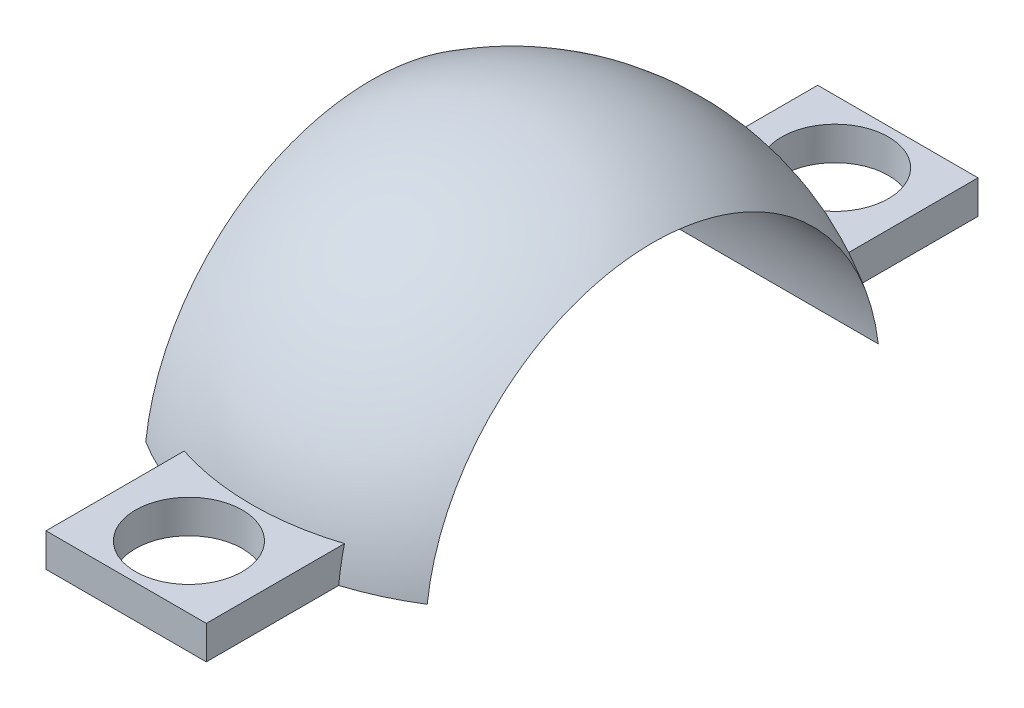
ISO-10303-21;
HEADER;
FILE_DESCRIPTION(('STEP AP214'),'2;1');
FILE_NAME('part.step','',(''),(''),'','','');
FILE_SCHEMA(('AUTOMOTIVE_DESIGN { 1 0 10303 214 1 1 1 1 }'));
ENDSEC;
DATA;
#1=APPLICATION_CONTEXT('core data for automotive mechanical design processes');
#2=APPLICATION_PROTOCOL_DEFINITION('international standard','automotive_design',2000,#1);
#3=PRODUCT_CONTEXT('',#1,'mechanical');
#4=PRODUCT('Part','Part','',(#3));
#5=PRODUCT_RELATED_PRODUCT_CATEGORY('part','',(#4));
#6=PRODUCT_DEFINITION_FORMATION('','',#4);
#7=PRODUCT_DEFINITION_CONTEXT('part definition',#1,'design');
#8=PRODUCT_DEFINITION('design','',#6,#7);
#9=PRODUCT_DEFINITION_SHAPE('','',#8);
#10=(LENGTH_UNIT() NAMED_UNIT(*) SI_UNIT(.MILLI.,.METRE.));
#11=(NAMED_UNIT(*) PLANE_ANGLE_UNIT() SI_UNIT($,.RADIAN.));
#12=(NAMED_UNIT(*) SI_UNIT($,.STERADIAN.) SOLID_ANGLE_UNIT());
#13=UNCERTAINTY_MEASURE_WITH_UNIT(LENGTH_MEASURE(1.E-05),#10,'distance_accuracy_value','');
#14=(GEOMETRIC_REPRESENTATION_CONTEXT(3) GLOBAL_UNCERTAINTY_ASSIGNED_CONTEXT((#13)) GLOBAL_UNIT_ASSIGNED_CONTEXT((#10,
#11,#12)) REPRESENTATION_CONTEXT('',''));
#15=CARTESIAN_POINT('',(0.,0.,0.));
#16=DIRECTION('',(0.,0.,1.));
#17=DIRECTION('',(1.,0.,0.));
#18=AXIS2_PLACEMENT_3D('',#15,#16,#17);
#19=CARTESIAN_POINT('',(60.,-5.00000000000006,0.));
#20=DIRECTION('',(-1.,0.,0.));
#21=DIRECTION('',(0.,0.,1.));
#22=AXIS2_PLACEMENT_3D('',#19,#20,#21);
#23=CYLINDRICAL_SURFACE('',#22,8.5);
#24=CARTESIAN_POINT('',(5.26782687642637,-5.00000000000006,0.));
#25=DIRECTION('',(-1.,0.,0.));
#26=DIRECTION('',(0.,0.,1.));
#27=AXIS2_PLACEMENT_3D('',#24,#25,#26);
#28=CIRCLE('',#27,8.5);
#29=CARTESIAN_POINT('',(5.26782687642637,-4.00000000000006,-8.44097150806707));
#30=VERTEX_POINT('',#29);
#31=CARTESIAN_POINT('',(5.26782687642637,-4.00000000000006,8.44097150806707));
#32=VERTEX_POINT('',#31);
#33=EDGE_CURVE('E206',#30,#32,#28,.F.);
#34=ORIENTED_EDGE('',*,*,#33,.T.);
#35=DIRECTION('',(-1.,0.,0.));
#36=VECTOR('',#35,1.);
#37=CARTESIAN_POINT('',(60.,-4.00000000000006,8.44097150806707));
#38=LINE('',#37,#36);
#39=CARTESIAN_POINT('',(-5.26782687642637,-4.00000000000006,8.44097150806707));
#40=VERTEX_POINT('',#39);
#41=EDGE_CURVE('E217',#32,#40,#38,.T.);
#42=ORIENTED_EDGE('',*,*,#41,.T.);
#43=CARTESIAN_POINT('',(-5.26782687642637,-5.00000000000006,0.));
#44=DIRECTION('',(1.,0.,0.));
#45=DIRECTION('',(0.,0.,-1.));
#46=AXIS2_PLACEMENT_3D('',#43,#44,#45);
#47=CIRCLE('',#46,8.5);
#48=CARTESIAN_POINT('',(-5.26782687642637,-4.00000000000006,-8.44097150806707));
#49=VERTEX_POINT('',#48);
#50=EDGE_CURVE('E210',#40,#49,#47,.F.);
#51=ORIENTED_EDGE('',*,*,#50,.T.);
#52=DIRECTION('',(-1.,0.,0.));
#53=VECTOR('',#52,1.);
#54=CARTESIAN_POINT('',(60.,-4.00000000000006,-8.44097150806707));
#55=LINE('',#54,#53);
#56=EDGE_CURVE('E214',#49,#30,#55,.F.);
#57=ORIENTED_EDGE('',*,*,#56,.T.);
#58=EDGE_LOOP('',(#34,#42,#51,#57));
#59=FACE_BOUND('',#58,.T.);
#60=ADVANCED_FACE('F47',(#59),#23,.F.);
#61=CARTESIAN_POINT('',(0.,-5.00000000000006,0.));
#62=DIRECTION('',(0.,-1.,0.));
#63=DIRECTION('',(0.,0.,1.));
#64=AXIS2_PLACEMENT_3D('',#61,#62,#63);
#65=SPHERICAL_SURFACE('',#64,10.);
#66=CARTESIAN_POINT('',(0.,-2.75000000000006,0.));
#67=DIRECTION('',(0.,-1.,0.));
#68=DIRECTION('',(0.,0.,-1.));
#69=AXIS2_PLACEMENT_3D('',#66,#67,#68);
#70=CIRCLE('',#69,9.74358763495254);
#71=CARTESIAN_POINT('',(-3.,-2.75000000000006,-9.27024810886958));
#72=VERTEX_POINT('',#71);
#73=CARTESIAN_POINT('',(3.,-2.75000000000006,-9.27024810886958));
#74=VERTEX_POINT('',#73);
#75=EDGE_CURVE('E12',#72,#74,#70,.T.);
#76=ORIENTED_EDGE('',*,*,#75,.F.);
#77=CARTESIAN_POINT('',(-3.,-5.00000000000006,0.));
#78=DIRECTION('',(-1.,0.,0.));
#79=DIRECTION('',(0.,0.,1.));
#80=AXIS2_PLACEMENT_3D('',#77,#78,#79);
#81=CIRCLE('',#80,9.53939201416946);
#82=CARTESIAN_POINT('',(-3.,-4.00000000000006,-9.48683298050514));
#83=VERTEX_POINT('',#82);
#84=EDGE_CURVE('E163',#72,#83,#81,.T.);
#85=ORIENTED_EDGE('',*,*,#84,.T.);
#86=CARTESIAN_POINT('',(0.,-4.00000000000006,0.));
#87=DIRECTION('',(0.,-1.,0.));
#88=DIRECTION('',(0.,0.,-1.));
#89=AXIS2_PLACEMENT_3D('',#86,#87,#88);
#90=CIRCLE('',#89,9.9498743710662);
#91=EDGE_CURVE('E129',#49,#83,#90,.T.);
#92=ORIENTED_EDGE('',*,*,#91,.F.);
#93=ORIENTED_EDGE('',*,*,#50,.F.);
#94=CARTESIAN_POINT('',(-3.,-4.00000000000006,9.48683298050514));
#95=VERTEX_POINT('',#94);
#96=EDGE_CURVE('E204',#95,#40,#90,.T.);
#97=ORIENTED_EDGE('',*,*,#96,.F.);
#98=CARTESIAN_POINT('',(-3.,-5.00000000000006,0.));
#99=DIRECTION('',(-1.,0.,0.));
#100=DIRECTION('',(0.,0.,1.));
#101=AXIS2_PLACEMENT_3D('',#98,#99,#100);
#102=CIRCLE('',#101,9.53939201416946);
#103=CARTESIAN_POINT('',(-3.,-2.75000000000006,9.27024810886958));
#104=VERTEX_POINT('',#103);
#105=EDGE_CURVE('E198',#95,#104,#102,.T.);
#106=ORIENTED_EDGE('',*,*,#105,.T.);
#107=CARTESIAN_POINT('',(0.,-2.75000000000006,0.));
#108=DIRECTION('',(0.,1.,0.));
#109=DIRECTION('',(0.,0.,1.));
#110=AXIS2_PLACEMENT_3D('',#107,#108,#109);
#111=CIRCLE('',#110,9.74358763495254);
#112=CARTESIAN_POINT('',(3.,-2.75000000000006,9.27024810886958));
#113=VERTEX_POINT('',#112);
#114=EDGE_CURVE('E56',#104,#113,#111,.T.);
#115=ORIENTED_EDGE('',*,*,#114,.T.);
#116=CARTESIAN_POINT('',(3.,-5.00000000000006,0.));
#117=DIRECTION('',(-1.,0.,0.));
#118=DIRECTION('',(0.,0.,1.));
#119=AXIS2_PLACEMENT_3D('',#116,#117,#118);
#120=CIRCLE('',#119,9.53939201416946);
#121=CARTESIAN_POINT('',(3.,-4.00000000000006,9.48683298050514));
#122=VERTEX_POINT('',#121);
#123=EDGE_CURVE('E191',#122,#113,#120,.T.);
#124=ORIENTED_EDGE('',*,*,#123,.F.);
#125=EDGE_CURVE('E205',#32,#122,#90,.T.);
#126=ORIENTED_EDGE('',*,*,#125,.F.);
#127=ORIENTED_EDGE('',*,*,#33,.F.);
#128=CARTESIAN_POINT('',(3.,-4.00000000000006,-9.48683298050514));
#129=VERTEX_POINT('',#128);
#130=EDGE_CURVE('E201',#129,#30,#90,.T.);
#131=ORIENTED_EDGE('',*,*,#130,.F.);
#132=CARTESIAN_POINT('',(3.,-5.00000000000006,0.));
#133=DIRECTION('',(-1.,0.,0.));
#134=DIRECTION('',(0.,0.,1.));
#135=AXIS2_PLACEMENT_3D('',#132,#133,#134);
#136=CIRCLE('',#135,9.53939201416946);
#137=EDGE_CURVE('E66',#74,#129,#136,.T.);
#138=ORIENTED_EDGE('',*,*,#137,.F.);
#139=EDGE_LOOP('',(#76,#85,#92,#93,#97,#106,#115,#124,#126,#127,#131,#138));
#140=FACE_BOUND('',#139,.T.);
#141=ADVANCED_FACE('F49',(#140),#65,.T.);
#142=CARTESIAN_POINT('',(60.,-4.00000000000006,11.3331012878524));
#143=DIRECTION('',(0.,-1.,0.));
#144=DIRECTION('',(0.,0.,-1.));
#145=AXIS2_PLACEMENT_3D('',#142,#143,#144);
#146=PLANE('',#145);
#147=CARTESIAN_POINT('',(0.,-4.00000000000006,-12.0922795715098));
#148=DIRECTION('',(0.,-1.,0.));
#149=DIRECTION('',(0.,0.,-1.));
#150=AXIS2_PLACEMENT_3D('',#147,#148,#149);
#151=CIRCLE('',#150,2.);
#152=CARTESIAN_POINT('',(0.,-4.00000000000006,-14.0922795715098));
#153=VERTEX_POINT('',#152);
#154=EDGE_CURVE('E256',#153,#153,#151,.T.);
#155=ORIENTED_EDGE('',*,*,#154,.F.);
#156=EDGE_LOOP('',(#155));
#157=FACE_BOUND('',#156,.T.);
#158=ORIENTED_EDGE('',*,*,#91,.T.);
#159=DIRECTION('',(0.,0.,-1.));
#160=VECTOR('',#159,1.);
#161=CARTESIAN_POINT('',(-3.,-4.00000000000006,-8.44097150806707));
#162=LINE('',#161,#160);
#163=CARTESIAN_POINT('',(-3.,-4.00000000000006,-14.4409715080671));
#164=VERTEX_POINT('',#163);
#165=EDGE_CURVE('E122',#83,#164,#162,.T.);
#166=ORIENTED_EDGE('',*,*,#165,.T.);
#167=DIRECTION('',(1.,0.,0.));
#168=VECTOR('',#167,1.);
#169=CARTESIAN_POINT('',(-3.,-4.00000000000006,-14.4409715080671));
#170=LINE('',#169,#168);
#171=CARTESIAN_POINT('',(3.,-4.00000000000006,-14.4409715080671));
#172=VERTEX_POINT('',#171);
#173=EDGE_CURVE('E126',#164,#172,#170,.T.);
#174=ORIENTED_EDGE('',*,*,#173,.T.);
#175=DIRECTION('',(0.,0.,-1.));
#176=VECTOR('',#175,1.);
#177=CARTESIAN_POINT('',(3.,-4.00000000000006,-8.44097150806707));
#178=LINE('',#177,#176);
#179=EDGE_CURVE('E151',#129,#172,#178,.T.);
#180=ORIENTED_EDGE('',*,*,#179,.F.);
#181=ORIENTED_EDGE('',*,*,#130,.T.);
#182=ORIENTED_EDGE('',*,*,#56,.F.);
#183=EDGE_LOOP('',(#158,#166,#174,#180,#181,#182));
#184=FACE_BOUND('',#183,.T.);
#185=ADVANCED_FACE('F124',(#157,#184),#146,.T.);
#186=CARTESIAN_POINT('',(0.,-4.00000000000006,12.0922795715098));
#187=DIRECTION('',(0.,-1.,0.));
#188=DIRECTION('',(0.,0.,-1.));
#189=AXIS2_PLACEMENT_3D('',#186,#187,#188);
#190=CIRCLE('',#189,2.);
#191=CARTESIAN_POINT('',(0.,-4.00000000000006,10.0922795715098));
#192=VERTEX_POINT('',#191);
#193=EDGE_CURVE('E252',#192,#192,#190,.F.);
#194=ORIENTED_EDGE('',*,*,#193,.T.);
#195=EDGE_LOOP('',(#194));
#196=FACE_BOUND('',#195,.T.);
#197=ORIENTED_EDGE('',*,*,#96,.T.);
#198=ORIENTED_EDGE('',*,*,#41,.F.);
#199=ORIENTED_EDGE('',*,*,#125,.T.);
#200=DIRECTION('',(0.,0.,1.));
#201=VECTOR('',#200,1.);
#202=CARTESIAN_POINT('',(3.,-4.00000000000006,8.44097150806707));
#203=LINE('',#202,#201);
#204=CARTESIAN_POINT('',(3.,-4.00000000000006,14.4409715080671));
#205=VERTEX_POINT('',#204);
#206=EDGE_CURVE('E173',#122,#205,#203,.T.);
#207=ORIENTED_EDGE('',*,*,#206,.T.);
#208=DIRECTION('',(1.,0.,0.));
#209=VECTOR('',#208,1.);
#210=CARTESIAN_POINT('',(-3.,-4.00000000000006,14.4409715080671));
#211=LINE('',#210,#209);
#212=CARTESIAN_POINT('',(-3.,-4.00000000000006,14.4409715080671));
#213=VERTEX_POINT('',#212);
#214=EDGE_CURVE('E187',#213,#205,#211,.T.);
#215=ORIENTED_EDGE('',*,*,#214,.F.);
#216=DIRECTION('',(0.,0.,1.));
#217=VECTOR('',#216,1.);
#218=CARTESIAN_POINT('',(-3.,-4.00000000000006,8.44097150806707));
#219=LINE('',#218,#217);
#220=EDGE_CURVE('E183',#95,#213,#219,.T.);
#221=ORIENTED_EDGE('',*,*,#220,.F.);
#222=EDGE_LOOP('',(#197,#198,#199,#207,#215,#221));
#223=FACE_BOUND('',#222,.T.);
#224=ADVANCED_FACE('F240',(#196,#223),#146,.T.);
#225=CARTESIAN_POINT('',(-3.,0.,0.));
#226=DIRECTION('',(-1.,0.,0.));
#227=DIRECTION('',(0.,0.,1.));
#228=AXIS2_PLACEMENT_3D('',#225,#226,#227);
#229=PLANE('',#228);
#230=ORIENTED_EDGE('',*,*,#105,.F.);
#231=ORIENTED_EDGE('',*,*,#220,.T.);
#232=DIRECTION('',(0.,1.,0.));
#233=VECTOR('',#232,1.);
#234=CARTESIAN_POINT('',(-3.,-4.00000000000006,14.4409715080671));
#235=LINE('',#234,#233);
#236=CARTESIAN_POINT('',(-3.,-2.75000000000006,14.4409715080671));
#237=VERTEX_POINT('',#236);
#238=EDGE_CURVE('E179',#213,#237,#235,.T.);
#239=ORIENTED_EDGE('',*,*,#238,.T.);
#240=DIRECTION('',(0.,0.,1.));
#241=VECTOR('',#240,1.);
#242=CARTESIAN_POINT('',(-3.,-2.75000000000006,8.44097150806707));
#243=LINE('',#242,#241);
#244=EDGE_CURVE('E176',#104,#237,#243,.T.);
#245=ORIENTED_EDGE('',*,*,#244,.F.);
#246=EDGE_LOOP('',(#230,#231,#239,#245));
#247=FACE_BOUND('',#246,.T.);
#248=ADVANCED_FACE('F293',(#247),#229,.T.);
#249=CARTESIAN_POINT('',(3.,0.,0.));
#250=DIRECTION('',(-1.,0.,0.));
#251=DIRECTION('',(0.,0.,1.));
#252=AXIS2_PLACEMENT_3D('',#249,#250,#251);
#253=PLANE('',#252);
#254=ORIENTED_EDGE('',*,*,#206,.F.);
#255=ORIENTED_EDGE('',*,*,#123,.T.);
#256=DIRECTION('',(0.,0.,1.));
#257=VECTOR('',#256,1.);
#258=CARTESIAN_POINT('',(3.,-2.75000000000006,8.44097150806707));
#259=LINE('',#258,#257);
#260=CARTESIAN_POINT('',(3.,-2.75000000000006,14.4409715080671));
#261=VERTEX_POINT('',#260);
#262=EDGE_CURVE('E166',#113,#261,#259,.T.);
#263=ORIENTED_EDGE('',*,*,#262,.T.);
#264=DIRECTION('',(0.,1.,0.));
#265=VECTOR('',#264,1.);
#266=CARTESIAN_POINT('',(3.,-4.00000000000006,14.4409715080671));
#267=LINE('',#266,#265);
#268=EDGE_CURVE('E169',#205,#261,#267,.T.);
#269=ORIENTED_EDGE('',*,*,#268,.F.);
#270=EDGE_LOOP('',(#254,#255,#263,#269));
#271=FACE_BOUND('',#270,.T.);
#272=ADVANCED_FACE('F229',(#271),#253,.F.);
#273=CARTESIAN_POINT('',(-3.,-2.75000000000006,8.44097150806707));
#274=DIRECTION('',(0.,1.,0.));
#275=DIRECTION('',(0.,0.,1.));
#276=AXIS2_PLACEMENT_3D('',#273,#274,#275);
#277=PLANE('',#276);
#278=CARTESIAN_POINT('',(0.,-2.75000000000006,12.0922795715098));
#279=DIRECTION('',(0.,-1.,0.));
#280=DIRECTION('',(0.,0.,-1.));
#281=AXIS2_PLACEMENT_3D('',#278,#279,#280);
#282=CIRCLE('',#281,2.);
#283=CARTESIAN_POINT('',(0.,-2.75000000000006,10.0922795715098));
#284=VERTEX_POINT('',#283);
#285=EDGE_CURVE('E263',#284,#284,#282,.T.);
#286=ORIENTED_EDGE('',*,*,#285,.T.);
#287=EDGE_LOOP('',(#286));
#288=FACE_BOUND('',#287,.T.);
#289=ORIENTED_EDGE('',*,*,#114,.F.);
#290=ORIENTED_EDGE('',*,*,#244,.T.);
#291=DIRECTION('',(1.,0.,0.));
#292=VECTOR('',#291,1.);
#293=CARTESIAN_POINT('',(-3.,-2.75000000000006,14.4409715080671));
#294=LINE('',#293,#292);
#295=EDGE_CURVE('E186',#237,#261,#294,.T.);
#296=ORIENTED_EDGE('',*,*,#295,.T.);
#297=ORIENTED_EDGE('',*,*,#262,.F.);
#298=EDGE_LOOP('',(#289,#290,#296,#297));
#299=FACE_BOUND('',#298,.T.);
#300=ADVANCED_FACE('F231',(#288,#299),#277,.T.);
#301=CARTESIAN_POINT('',(-3.,-4.00000000000006,14.4409715080671));
#302=DIRECTION('',(0.,0.,-1.));
#303=DIRECTION('',(-1.,0.,0.));
#304=AXIS2_PLACEMENT_3D('',#301,#302,#303);
#305=PLANE('',#304);
#306=ORIENTED_EDGE('',*,*,#214,.T.);
#307=ORIENTED_EDGE('',*,*,#268,.T.);
#308=ORIENTED_EDGE('',*,*,#295,.F.);
#309=ORIENTED_EDGE('',*,*,#238,.F.);
#310=EDGE_LOOP('',(#306,#307,#308,#309));
#311=FACE_BOUND('',#310,.T.);
#312=ADVANCED_FACE('F235',(#311),#305,.F.);
#313=CARTESIAN_POINT('',(-3.,0.,0.));
#314=DIRECTION('',(-1.,0.,0.));
#315=DIRECTION('',(0.,0.,1.));
#316=AXIS2_PLACEMENT_3D('',#313,#314,#315);
#317=PLANE('',#316);
#318=ORIENTED_EDGE('',*,*,#84,.F.);
#319=DIRECTION('',(0.,0.,-1.));
#320=VECTOR('',#319,1.);
#321=CARTESIAN_POINT('',(-3.,-2.75000000000006,-8.44097150806707));
#322=LINE('',#321,#320);
#323=CARTESIAN_POINT('',(-3.,-2.75000000000006,-14.4409715080671));
#324=VERTEX_POINT('',#323);
#325=EDGE_CURVE('E146',#72,#324,#322,.T.);
#326=ORIENTED_EDGE('',*,*,#325,.T.);
#327=DIRECTION('',(0.,1.,0.));
#328=VECTOR('',#327,1.);
#329=CARTESIAN_POINT('',(-3.,-4.00000000000006,-14.4409715080671));
#330=LINE('',#329,#328);
#331=EDGE_CURVE('E133',#164,#324,#330,.T.);
#332=ORIENTED_EDGE('',*,*,#331,.F.);
#333=ORIENTED_EDGE('',*,*,#165,.F.);
#334=EDGE_LOOP('',(#318,#326,#332,#333));
#335=FACE_BOUND('',#334,.T.);
#336=ADVANCED_FACE('F144',(#335),#317,.T.);
#337=CARTESIAN_POINT('',(3.,0.,0.));
#338=DIRECTION('',(-1.,0.,0.));
#339=DIRECTION('',(0.,0.,1.));
#340=AXIS2_PLACEMENT_3D('',#337,#338,#339);
#341=PLANE('',#340);
#342=DIRECTION('',(0.,0.,-1.));
#343=VECTOR('',#342,1.);
#344=CARTESIAN_POINT('',(3.,-2.75000000000006,-8.44097150806707));
#345=LINE('',#344,#343);
#346=CARTESIAN_POINT('',(3.,-2.75000000000006,-14.4409715080671));
#347=VERTEX_POINT('',#346);
#348=EDGE_CURVE('E158',#74,#347,#345,.T.);
#349=ORIENTED_EDGE('',*,*,#348,.F.);
#350=ORIENTED_EDGE('',*,*,#137,.T.);
#351=ORIENTED_EDGE('',*,*,#179,.T.);
#352=DIRECTION('',(0.,1.,0.));
#353=VECTOR('',#352,1.);
#354=CARTESIAN_POINT('',(3.,-4.00000000000006,-14.4409715080671));
#355=LINE('',#354,#353);
#356=EDGE_CURVE('E140',#172,#347,#355,.T.);
#357=ORIENTED_EDGE('',*,*,#356,.T.);
#358=EDGE_LOOP('',(#349,#350,#351,#357));
#359=FACE_BOUND('',#358,.T.);
#360=ADVANCED_FACE('F274',(#359),#341,.F.);
#361=CARTESIAN_POINT('',(-3.,-2.75000000000006,-8.44097150806707));
#362=DIRECTION('',(0.,-1.,0.));
#363=DIRECTION('',(0.,0.,-1.));
#364=AXIS2_PLACEMENT_3D('',#361,#362,#363);
#365=PLANE('',#364);
#366=CARTESIAN_POINT('',(0.,-2.75000000000006,-12.0922795715098));
#367=DIRECTION('',(0.,1.,0.));
#368=DIRECTION('',(0.,0.,1.));
#369=AXIS2_PLACEMENT_3D('',#366,#367,#368);
#370=CIRCLE('',#369,2.);
#371=CARTESIAN_POINT('',(0.,-2.75000000000006,-10.0922795715098));
#372=VERTEX_POINT('',#371);
#373=EDGE_CURVE('E262',#372,#372,#370,.T.);
#374=ORIENTED_EDGE('',*,*,#373,.F.);
#375=EDGE_LOOP('',(#374));
#376=FACE_BOUND('',#375,.T.);
#377=ORIENTED_EDGE('',*,*,#325,.F.);
#378=ORIENTED_EDGE('',*,*,#75,.T.);
#379=ORIENTED_EDGE('',*,*,#348,.T.);
#380=DIRECTION('',(1.,0.,0.));
#381=VECTOR('',#380,1.);
#382=CARTESIAN_POINT('',(-3.,-2.75000000000006,-14.4409715080671));
#383=LINE('',#382,#381);
#384=EDGE_CURVE('E142',#324,#347,#383,.T.);
#385=ORIENTED_EDGE('',*,*,#384,.F.);
#386=EDGE_LOOP('',(#377,#378,#379,#385));
#387=FACE_BOUND('',#386,.T.);
#388=ADVANCED_FACE('F249',(#376,#387),#365,.F.);
#389=CARTESIAN_POINT('',(-3.,-4.00000000000006,-14.4409715080671));
#390=DIRECTION('',(0.,0.,-1.));
#391=DIRECTION('',(-1.,0.,0.));
#392=AXIS2_PLACEMENT_3D('',#389,#390,#391);
#393=PLANE('',#392);
#394=ORIENTED_EDGE('',*,*,#384,.T.);
#395=ORIENTED_EDGE('',*,*,#356,.F.);
#396=ORIENTED_EDGE('',*,*,#173,.F.);
#397=ORIENTED_EDGE('',*,*,#331,.T.);
#398=EDGE_LOOP('',(#394,#395,#396,#397));
#399=FACE_BOUND('',#398,.T.);
#400=ADVANCED_FACE('F138',(#399),#393,.T.);
#401=CARTESIAN_POINT('',(0.,-9.25000000000006,-12.0922795715098));
#402=DIRECTION('',(0.,1.,0.));
#403=DIRECTION('',(0.,0.,1.));
#404=AXIS2_PLACEMENT_3D('',#401,#402,#403);
#405=CYLINDRICAL_SURFACE('',#404,2.);
#406=ORIENTED_EDGE('',*,*,#154,.T.);
#407=EDGE_LOOP('',(#406));
#408=FACE_BOUND('',#407,.T.);
#409=ORIENTED_EDGE('',*,*,#373,.T.);
#410=EDGE_LOOP('',(#409));
#411=FACE_BOUND('',#410,.T.);
#412=ADVANCED_FACE('F271',(#408,#411),#405,.F.);
#413=CARTESIAN_POINT('',(0.,-9.25000000000006,12.0922795715098));
#414=DIRECTION('',(0.,1.,0.));
#415=DIRECTION('',(0.,0.,1.));
#416=AXIS2_PLACEMENT_3D('',#413,#414,#415);
#417=CYLINDRICAL_SURFACE('',#416,2.);
#418=ORIENTED_EDGE('',*,*,#193,.F.);
#419=EDGE_LOOP('',(#418));
#420=FACE_BOUND('',#419,.T.);
#421=ORIENTED_EDGE('',*,*,#285,.F.);
#422=EDGE_LOOP('',(#421));
#423=FACE_BOUND('',#422,.T.);
#424=ADVANCED_FACE('F360',(#420,#423),#417,.F.);
#425=CLOSED_SHELL('',(#60,#141,#185,#224,#248,#272,#300,#312,#336,#360,#388,#400,#412,#424));
#426=MANIFOLD_SOLID_BREP('B2',#425);
#427=ADVANCED_BREP_SHAPE_REPRESENTATION('',(#18,#426),#14);
#428=SHAPE_DEFINITION_REPRESENTATION(#9,#427);
ENDSEC;
END-ISO-10303-21;
